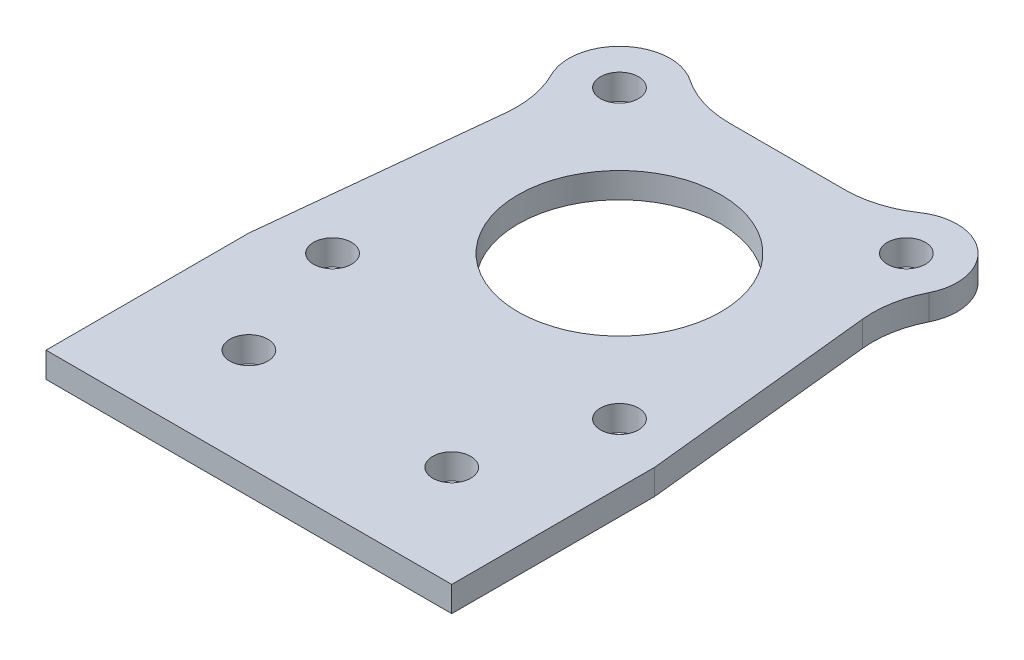
ISO-10303-21;
HEADER;
FILE_DESCRIPTION(('STEP AP214'),'2;1');
FILE_NAME('part.step','',(''),(''),'','','');
FILE_SCHEMA(('AUTOMOTIVE_DESIGN { 1 0 10303 214 1 1 1 1 }'));
ENDSEC;
DATA;
#1=APPLICATION_CONTEXT('core data for automotive mechanical design processes');
#2=APPLICATION_PROTOCOL_DEFINITION('international standard','automotive_design',2000,#1);
#3=PRODUCT_CONTEXT('',#1,'mechanical');
#4=PRODUCT('Part','Part','',(#3));
#5=PRODUCT_RELATED_PRODUCT_CATEGORY('part','',(#4));
#6=PRODUCT_DEFINITION_FORMATION('','',#4);
#7=PRODUCT_DEFINITION_CONTEXT('part definition',#1,'design');
#8=PRODUCT_DEFINITION('design','',#6,#7);
#9=PRODUCT_DEFINITION_SHAPE('','',#8);
#10=(LENGTH_UNIT() NAMED_UNIT(*) SI_UNIT(.MILLI.,.METRE.));
#11=(NAMED_UNIT(*) PLANE_ANGLE_UNIT() SI_UNIT($,.RADIAN.));
#12=(NAMED_UNIT(*) SI_UNIT($,.STERADIAN.) SOLID_ANGLE_UNIT());
#13=UNCERTAINTY_MEASURE_WITH_UNIT(LENGTH_MEASURE(1.E-05),#10,'distance_accuracy_value','');
#14=(GEOMETRIC_REPRESENTATION_CONTEXT(3) GLOBAL_UNCERTAINTY_ASSIGNED_CONTEXT((#13)) GLOBAL_UNIT_ASSIGNED_CONTEXT((#10,
#11,#12)) REPRESENTATION_CONTEXT('',''));
#15=CARTESIAN_POINT('',(0.,0.,0.));
#16=DIRECTION('',(0.,0.,1.));
#17=DIRECTION('',(1.,0.,0.));
#18=AXIS2_PLACEMENT_3D('',#15,#16,#17);
#19=CARTESIAN_POINT('',(-46.4,3.175,0.));
#20=DIRECTION('',(0.994557231920338,0.,0.104191710010702));
#21=DIRECTION('',(0.104191710010702,0.,-0.994557231920338));
#22=AXIS2_PLACEMENT_3D('',#19,#20,#21);
#23=PLANE('',#22);
#24=DIRECTION('',(-0.104191710010702,0.,0.994557231920338));
#25=VECTOR('',#24,1.);
#26=CARTESIAN_POINT('',(-46.4,3.175,0.));
#27=LINE('',#26,#25);
#28=CARTESIAN_POINT('',(-43.35282821594,3.175,-29.0866397569361));
#29=VERTEX_POINT('',#28);
#30=CARTESIAN_POINT('',(-46.4,3.175,0.));
#31=VERTEX_POINT('',#30);
#32=EDGE_CURVE('E118',#29,#31,#27,.T.);
#33=ORIENTED_EDGE('',*,*,#32,.F.);
#34=DIRECTION('',(0.,1.,0.));
#35=VECTOR('',#34,1.);
#36=CARTESIAN_POINT('',(-43.35282821594,3.175,-29.0866397569361));
#37=LINE('',#36,#35);
#38=CARTESIAN_POINT('',(-43.35282821594,0.,-29.0866397569361));
#39=VERTEX_POINT('',#38);
#40=EDGE_CURVE('E163',#29,#39,#37,.F.);
#41=ORIENTED_EDGE('',*,*,#40,.T.);
#42=DIRECTION('',(-0.104191710010702,0.,0.994557231920338));
#43=VECTOR('',#42,1.);
#44=CARTESIAN_POINT('',(-46.4,0.,0.));
#45=LINE('',#44,#43);
#46=CARTESIAN_POINT('',(-46.4,0.,0.));
#47=VERTEX_POINT('',#46);
#48=EDGE_CURVE('E139',#39,#47,#45,.T.);
#49=ORIENTED_EDGE('',*,*,#48,.T.);
#50=DIRECTION('',(0.,-1.,0.));
#51=VECTOR('',#50,1.);
#52=CARTESIAN_POINT('',(-46.4,3.175,0.));
#53=LINE('',#52,#51);
#54=EDGE_CURVE('E132',#31,#47,#53,.T.);
#55=ORIENTED_EDGE('',*,*,#54,.F.);
#56=EDGE_LOOP('',(#33,#41,#49,#55));
#57=FACE_BOUND('',#56,.T.);
#58=ADVANCED_FACE('F33',(#57),#23,.F.);
#59=CARTESIAN_POINT('',(-46.4,3.175,0.));
#60=DIRECTION('',(1.,0.,0.));
#61=DIRECTION('',(0.,0.,-1.));
#62=AXIS2_PLACEMENT_3D('',#59,#60,#61);
#63=PLANE('',#62);
#64=DIRECTION('',(0.,0.,1.));
#65=VECTOR('',#64,1.);
#66=CARTESIAN_POINT('',(-46.4,0.,0.));
#67=LINE('',#66,#65);
#68=CARTESIAN_POINT('',(-46.4,0.,25.4));
#69=VERTEX_POINT('',#68);
#70=EDGE_CURVE('E239',#47,#69,#67,.T.);
#71=ORIENTED_EDGE('',*,*,#70,.T.);
#72=DIRECTION('',(0.,-1.,0.));
#73=VECTOR('',#72,1.);
#74=CARTESIAN_POINT('',(-46.4,3.175,25.4));
#75=LINE('',#74,#73);
#76=CARTESIAN_POINT('',(-46.4,3.175,25.4));
#77=VERTEX_POINT('',#76);
#78=EDGE_CURVE('E134',#77,#69,#75,.T.);
#79=ORIENTED_EDGE('',*,*,#78,.F.);
#80=DIRECTION('',(0.,0.,1.));
#81=VECTOR('',#80,1.);
#82=CARTESIAN_POINT('',(-46.4,3.175,0.));
#83=LINE('',#82,#81);
#84=EDGE_CURVE('E123',#31,#77,#83,.T.);
#85=ORIENTED_EDGE('',*,*,#84,.F.);
#86=ORIENTED_EDGE('',*,*,#54,.T.);
#87=EDGE_LOOP('',(#71,#79,#85,#86));
#88=FACE_BOUND('',#87,.T.);
#89=ADVANCED_FACE('F131',(#88),#63,.F.);
#90=CARTESIAN_POINT('',(4.40000000000001,3.175,25.4));
#91=DIRECTION('',(0.,0.,-1.));
#92=DIRECTION('',(-1.,0.,0.));
#93=AXIS2_PLACEMENT_3D('',#90,#91,#92);
#94=PLANE('',#93);
#95=DIRECTION('',(1.,0.,0.));
#96=VECTOR('',#95,1.);
#97=CARTESIAN_POINT('',(4.40000000000001,0.,25.4));
#98=LINE('',#97,#96);
#99=CARTESIAN_POINT('',(4.40000000000001,0.,25.4));
#100=VERTEX_POINT('',#99);
#101=EDGE_CURVE('E242',#69,#100,#98,.T.);
#102=ORIENTED_EDGE('',*,*,#101,.T.);
#103=DIRECTION('',(0.,-1.,0.));
#104=VECTOR('',#103,1.);
#105=CARTESIAN_POINT('',(4.40000000000001,3.175,25.4));
#106=LINE('',#105,#104);
#107=CARTESIAN_POINT('',(4.40000000000001,3.175,25.4));
#108=VERTEX_POINT('',#107);
#109=EDGE_CURVE('E146',#108,#100,#106,.T.);
#110=ORIENTED_EDGE('',*,*,#109,.F.);
#111=DIRECTION('',(1.,0.,0.));
#112=VECTOR('',#111,1.);
#113=CARTESIAN_POINT('',(4.40000000000001,3.175,25.4));
#114=LINE('',#113,#112);
#115=EDGE_CURVE('E136',#77,#108,#114,.T.);
#116=ORIENTED_EDGE('',*,*,#115,.F.);
#117=ORIENTED_EDGE('',*,*,#78,.T.);
#118=EDGE_LOOP('',(#102,#110,#116,#117));
#119=FACE_BOUND('',#118,.T.);
#120=ADVANCED_FACE('F203',(#119),#94,.F.);
#121=CARTESIAN_POINT('',(4.40000000000001,3.175,0.));
#122=DIRECTION('',(-1.,0.,0.));
#123=DIRECTION('',(0.,0.,1.));
#124=AXIS2_PLACEMENT_3D('',#121,#122,#123);
#125=PLANE('',#124);
#126=DIRECTION('',(0.,0.,-1.));
#127=VECTOR('',#126,1.);
#128=CARTESIAN_POINT('',(4.40000000000001,0.,0.));
#129=LINE('',#128,#127);
#130=CARTESIAN_POINT('',(4.40000000000001,0.,0.));
#131=VERTEX_POINT('',#130);
#132=EDGE_CURVE('E244',#100,#131,#129,.T.);
#133=ORIENTED_EDGE('',*,*,#132,.T.);
#134=DIRECTION('',(0.,-1.,0.));
#135=VECTOR('',#134,1.);
#136=CARTESIAN_POINT('',(4.40000000000001,3.175,0.));
#137=LINE('',#136,#135);
#138=CARTESIAN_POINT('',(4.40000000000001,3.175,0.));
#139=VERTEX_POINT('',#138);
#140=EDGE_CURVE('E229',#139,#131,#137,.T.);
#141=ORIENTED_EDGE('',*,*,#140,.F.);
#142=DIRECTION('',(0.,0.,-1.));
#143=VECTOR('',#142,1.);
#144=CARTESIAN_POINT('',(4.40000000000001,3.175,0.));
#145=LINE('',#144,#143);
#146=EDGE_CURVE('E234',#108,#139,#145,.T.);
#147=ORIENTED_EDGE('',*,*,#146,.F.);
#148=ORIENTED_EDGE('',*,*,#109,.T.);
#149=EDGE_LOOP('',(#133,#141,#147,#148));
#150=FACE_BOUND('',#149,.T.);
#151=ADVANCED_FACE('F254',(#150),#125,.F.);
#152=CARTESIAN_POINT('',(0.,3.175,-42.));
#153=DIRECTION('',(-0.994557231920338,0.,0.104191710010702));
#154=DIRECTION('',(0.104191710010702,0.,0.994557231920338));
#155=AXIS2_PLACEMENT_3D('',#152,#153,#154);
#156=PLANE('',#155);
#157=DIRECTION('',(-0.104191710010702,0.,-0.994557231920338));
#158=VECTOR('',#157,1.);
#159=CARTESIAN_POINT('',(0.,0.,-42.));
#160=LINE('',#159,#158);
#161=CARTESIAN_POINT('',(1.35282821594003,0.,-29.0866397569361));
#162=VERTEX_POINT('',#161);
#163=EDGE_CURVE('E246',#131,#162,#160,.T.);
#164=ORIENTED_EDGE('',*,*,#163,.T.);
#165=DIRECTION('',(0.,1.,0.));
#166=VECTOR('',#165,1.);
#167=CARTESIAN_POINT('',(1.35282821594003,3.175,-29.0866397569361));
#168=LINE('',#167,#166);
#169=CARTESIAN_POINT('',(1.35282821594003,3.175,-29.0866397569361));
#170=VERTEX_POINT('',#169);
#171=EDGE_CURVE('E141',#162,#170,#168,.T.);
#172=ORIENTED_EDGE('',*,*,#171,.T.);
#173=DIRECTION('',(-0.104191710010702,0.,-0.994557231920338));
#174=VECTOR('',#173,1.);
#175=CARTESIAN_POINT('',(0.,3.175,-42.));
#176=LINE('',#175,#174);
#177=EDGE_CURVE('E230',#139,#170,#176,.T.);
#178=ORIENTED_EDGE('',*,*,#177,.F.);
#179=ORIENTED_EDGE('',*,*,#140,.T.);
#180=EDGE_LOOP('',(#164,#172,#178,#179));
#181=FACE_BOUND('',#180,.T.);
#182=ADVANCED_FACE('F263',(#181),#156,.F.);
#183=CARTESIAN_POINT('',(0.,3.175,-42.));
#184=DIRECTION('',(0.,0.,1.));
#185=DIRECTION('',(1.,0.,0.));
#186=AXIS2_PLACEMENT_3D('',#183,#184,#185);
#187=PLANE('',#186);
#188=DIRECTION('',(-1.,0.,0.));
#189=VECTOR('',#188,1.);
#190=CARTESIAN_POINT('',(0.,3.175,-42.));
#191=LINE('',#190,#189);
#192=CARTESIAN_POINT('',(-13.771264177454,3.175,-42.));
#193=VERTEX_POINT('',#192);
#194=CARTESIAN_POINT('',(-28.228735822546,3.175,-42.));
#195=VERTEX_POINT('',#194);
#196=EDGE_CURVE('E222',#193,#195,#191,.T.);
#197=ORIENTED_EDGE('',*,*,#196,.F.);
#198=DIRECTION('',(0.,1.,0.));
#199=VECTOR('',#198,1.);
#200=CARTESIAN_POINT('',(-13.771264177454,3.175,-42.));
#201=LINE('',#200,#199);
#202=CARTESIAN_POINT('',(-13.771264177454,0.,-42.));
#203=VERTEX_POINT('',#202);
#204=EDGE_CURVE('E156',#193,#203,#201,.F.);
#205=ORIENTED_EDGE('',*,*,#204,.T.);
#206=DIRECTION('',(-1.,0.,0.));
#207=VECTOR('',#206,1.);
#208=CARTESIAN_POINT('',(0.,0.,-42.));
#209=LINE('',#208,#207);
#210=CARTESIAN_POINT('',(-28.228735822546,0.,-42.));
#211=VERTEX_POINT('',#210);
#212=EDGE_CURVE('E127',#203,#211,#209,.T.);
#213=ORIENTED_EDGE('',*,*,#212,.T.);
#214=DIRECTION('',(0.,1.,0.));
#215=VECTOR('',#214,1.);
#216=CARTESIAN_POINT('',(-28.228735822546,3.175,-42.));
#217=LINE('',#216,#215);
#218=EDGE_CURVE('E153',#211,#195,#217,.T.);
#219=ORIENTED_EDGE('',*,*,#218,.T.);
#220=EDGE_LOOP('',(#197,#205,#213,#219));
#221=FACE_BOUND('',#220,.T.);
#222=ADVANCED_FACE('F226',(#221),#187,.F.);
#223=CARTESIAN_POINT('',(0.,3.175,0.));
#224=DIRECTION('',(0.,1.,0.));
#225=DIRECTION('',(0.,0.,1.));
#226=AXIS2_PLACEMENT_3D('',#223,#224,#225);
#227=PLANE('',#226);
#228=CARTESIAN_POINT('',(-33.7,3.175,12.7));
#229=DIRECTION('',(0.,1.,0.));
#230=DIRECTION('',(0.,0.,1.));
#231=AXIS2_PLACEMENT_3D('',#228,#229,#230);
#232=CIRCLE('',#231,2.38125);
#233=CARTESIAN_POINT('',(-33.7,3.175,15.08125));
#234=VERTEX_POINT('',#233);
#235=EDGE_CURVE('E360',#234,#234,#232,.T.);
#236=ORIENTED_EDGE('',*,*,#235,.F.);
#237=EDGE_LOOP('',(#236));
#238=FACE_BOUND('',#237,.T.);
#239=CARTESIAN_POINT('',(-8.3,3.175,12.7));
#240=DIRECTION('',(0.,1.,0.));
#241=DIRECTION('',(0.,0.,1.));
#242=AXIS2_PLACEMENT_3D('',#239,#240,#241);
#243=CIRCLE('',#242,2.38125);
#244=CARTESIAN_POINT('',(-8.3,3.175,15.08125));
#245=VERTEX_POINT('',#244);
#246=EDGE_CURVE('E274',#245,#245,#243,.T.);
#247=ORIENTED_EDGE('',*,*,#246,.F.);
#248=EDGE_LOOP('',(#247));
#249=FACE_BOUND('',#248,.T.);
#250=ORIENTED_EDGE('',*,*,#177,.T.);
#251=CARTESIAN_POINT('',(13.9837050613283,3.175,-30.409874474072));
#252=DIRECTION('',(0.,1.,0.));
#253=DIRECTION('',(0.,0.,1.));
#254=AXIS2_PLACEMENT_3D('',#251,#252,#253);
#255=CIRCLE('',#254,12.7);
#256=CARTESIAN_POINT('',(2.63490984853505,3.175,-36.1102996527828));
#257=VERTEX_POINT('',#256);
#258=EDGE_CURVE('E165',#170,#257,#255,.F.);
#259=ORIENTED_EDGE('',*,*,#258,.T.);
#260=CARTESIAN_POINT('',(-3.0394877578616,3.175,-38.9605122421382));
#261=DIRECTION('',(0.,1.,0.));
#262=DIRECTION('',(0.,0.,-1.));
#263=AXIS2_PLACEMENT_3D('',#260,#261,#262);
#264=CIRCLE('',#263,6.35);
#265=CARTESIAN_POINT('',(-6.61674656439239,3.175,-44.2070081614255));
#266=VERTEX_POINT('',#265);
#267=EDGE_CURVE('E224',#257,#266,#264,.T.);
#268=ORIENTED_EDGE('',*,*,#267,.T.);
#269=CARTESIAN_POINT('',(-13.771264177454,3.175,-54.7));
#270=DIRECTION('',(0.,1.,0.));
#271=DIRECTION('',(0.,0.,1.));
#272=AXIS2_PLACEMENT_3D('',#269,#270,#271);
#273=CIRCLE('',#272,12.7);
#274=EDGE_CURVE('E171',#266,#193,#273,.F.);
#275=ORIENTED_EDGE('',*,*,#274,.T.);
#276=ORIENTED_EDGE('',*,*,#196,.T.);
#277=CARTESIAN_POINT('',(-28.228735822546,3.175,-54.7));
#278=DIRECTION('',(0.,1.,0.));
#279=DIRECTION('',(0.,0.,1.));
#280=AXIS2_PLACEMENT_3D('',#277,#278,#279);
#281=CIRCLE('',#280,12.7);
#282=CARTESIAN_POINT('',(-35.3832534356076,3.175,-44.2070081614255));
#283=VERTEX_POINT('',#282);
#284=EDGE_CURVE('E173',#195,#283,#281,.F.);
#285=ORIENTED_EDGE('',*,*,#284,.T.);
#286=CARTESIAN_POINT('',(-38.9605122421384,3.175,-38.9605122421382));
#287=DIRECTION('',(0.,1.,0.));
#288=DIRECTION('',(0.,0.,1.));
#289=AXIS2_PLACEMENT_3D('',#286,#287,#288);
#290=CIRCLE('',#289,6.35);
#291=CARTESIAN_POINT('',(-44.6349098485351,3.175,-36.1102996527828));
#292=VERTEX_POINT('',#291);
#293=EDGE_CURVE('E189',#283,#292,#290,.T.);
#294=ORIENTED_EDGE('',*,*,#293,.T.);
#295=CARTESIAN_POINT('',(-55.9837050613283,3.175,-30.409874474072));
#296=DIRECTION('',(0.,1.,0.));
#297=DIRECTION('',(0.,0.,1.));
#298=AXIS2_PLACEMENT_3D('',#295,#296,#297);
#299=CIRCLE('',#298,12.7);
#300=EDGE_CURVE('E11',#292,#29,#299,.F.);
#301=ORIENTED_EDGE('',*,*,#300,.T.);
#302=ORIENTED_EDGE('',*,*,#32,.T.);
#303=ORIENTED_EDGE('',*,*,#84,.T.);
#304=ORIENTED_EDGE('',*,*,#115,.T.);
#305=ORIENTED_EDGE('',*,*,#146,.T.);
#306=EDGE_LOOP('',(#250,#259,#268,#275,#276,#285,#294,#301,#302,#303,#304,#305));
#307=FACE_BOUND('',#306,.T.);
#308=CARTESIAN_POINT('',(-3.03948775786098,3.175,-3.03948775786242));
#309=DIRECTION('',(0.,1.,0.));
#310=DIRECTION('',(0.,0.,1.));
#311=AXIS2_PLACEMENT_3D('',#308,#309,#310);
#312=CIRCLE('',#311,2.38125);
#313=CARTESIAN_POINT('',(-3.03948775786098,3.175,-0.658237757862424));
#314=VERTEX_POINT('',#313);
#315=EDGE_CURVE('E281',#314,#314,#312,.T.);
#316=ORIENTED_EDGE('',*,*,#315,.F.);
#317=EDGE_LOOP('',(#316));
#318=FACE_BOUND('',#317,.T.);
#319=CARTESIAN_POINT('',(-38.9605122421376,3.175,-3.03948775786153));
#320=DIRECTION('',(0.,1.,0.));
#321=DIRECTION('',(0.,0.,1.));
#322=AXIS2_PLACEMENT_3D('',#319,#320,#321);
#323=CIRCLE('',#322,2.38125);
#324=CARTESIAN_POINT('',(-38.9605122421376,3.175,-0.658237757861529));
#325=VERTEX_POINT('',#324);
#326=EDGE_CURVE('E287',#325,#325,#323,.T.);
#327=ORIENTED_EDGE('',*,*,#326,.F.);
#328=EDGE_LOOP('',(#327));
#329=FACE_BOUND('',#328,.T.);
#330=CARTESIAN_POINT('',(-21.,3.175,-21.));
#331=DIRECTION('',(0.,1.,0.));
#332=DIRECTION('',(0.,0.,1.));
#333=AXIS2_PLACEMENT_3D('',#330,#331,#332);
#334=CIRCLE('',#333,12.7);
#335=CARTESIAN_POINT('',(-21.,3.175,-8.30000000000001));
#336=VERTEX_POINT('',#335);
#337=EDGE_CURVE('E299',#336,#336,#334,.T.);
#338=ORIENTED_EDGE('',*,*,#337,.F.);
#339=EDGE_LOOP('',(#338));
#340=FACE_BOUND('',#339,.T.);
#341=CARTESIAN_POINT('',(-38.9605122421384,3.175,-38.9605122421382));
#342=DIRECTION('',(0.,1.,0.));
#343=DIRECTION('',(0.,0.,1.));
#344=AXIS2_PLACEMENT_3D('',#341,#342,#343);
#345=CIRCLE('',#344,2.38125);
#346=CARTESIAN_POINT('',(-38.9605122421384,3.175,-36.5792622421382));
#347=VERTEX_POINT('',#346);
#348=EDGE_CURVE('E293',#347,#347,#345,.T.);
#349=ORIENTED_EDGE('',*,*,#348,.F.);
#350=EDGE_LOOP('',(#349));
#351=FACE_BOUND('',#350,.T.);
#352=CARTESIAN_POINT('',(-3.03948775786199,3.175,-38.9605122421391));
#353=DIRECTION('',(0.,1.,0.));
#354=DIRECTION('',(0.,0.,1.));
#355=AXIS2_PLACEMENT_3D('',#352,#353,#354);
#356=CIRCLE('',#355,2.38125);
#357=CARTESIAN_POINT('',(-3.03948775786199,3.175,-36.5792622421391));
#358=VERTEX_POINT('',#357);
#359=EDGE_CURVE('E188',#358,#358,#356,.T.);
#360=ORIENTED_EDGE('',*,*,#359,.F.);
#361=EDGE_LOOP('',(#360));
#362=FACE_BOUND('',#361,.T.);
#363=ADVANCED_FACE('F121',(#238,#249,#307,#318,#329,#340,#351,#362),#227,.T.);
#364=CARTESIAN_POINT('',(0.,0.,0.));
#365=DIRECTION('',(0.,1.,0.));
#366=DIRECTION('',(0.,0.,1.));
#367=AXIS2_PLACEMENT_3D('',#364,#365,#366);
#368=PLANE('',#367);
#369=CARTESIAN_POINT('',(-33.7,0.,12.7));
#370=DIRECTION('',(0.,1.,0.));
#371=DIRECTION('',(0.,0.,1.));
#372=AXIS2_PLACEMENT_3D('',#369,#370,#371);
#373=CIRCLE('',#372,2.38125);
#374=CARTESIAN_POINT('',(-33.7,0.,15.08125));
#375=VERTEX_POINT('',#374);
#376=EDGE_CURVE('E357',#375,#375,#373,.T.);
#377=ORIENTED_EDGE('',*,*,#376,.T.);
#378=EDGE_LOOP('',(#377));
#379=FACE_BOUND('',#378,.T.);
#380=CARTESIAN_POINT('',(-8.3,0.,12.7));
#381=DIRECTION('',(0.,1.,0.));
#382=DIRECTION('',(0.,0.,1.));
#383=AXIS2_PLACEMENT_3D('',#380,#381,#382);
#384=CIRCLE('',#383,2.38125);
#385=CARTESIAN_POINT('',(-8.3,0.,15.08125));
#386=VERTEX_POINT('',#385);
#387=EDGE_CURVE('E270',#386,#386,#384,.T.);
#388=ORIENTED_EDGE('',*,*,#387,.T.);
#389=EDGE_LOOP('',(#388));
#390=FACE_BOUND('',#389,.T.);
#391=ORIENTED_EDGE('',*,*,#212,.F.);
#392=CARTESIAN_POINT('',(-13.771264177454,0.,-54.7));
#393=DIRECTION('',(0.,1.,0.));
#394=DIRECTION('',(0.,0.,1.));
#395=AXIS2_PLACEMENT_3D('',#392,#393,#394);
#396=CIRCLE('',#395,12.7);
#397=CARTESIAN_POINT('',(-6.61674656439239,0.,-44.2070081614255));
#398=VERTEX_POINT('',#397);
#399=EDGE_CURVE('E169',#203,#398,#396,.T.);
#400=ORIENTED_EDGE('',*,*,#399,.T.);
#401=CARTESIAN_POINT('',(-3.0394877578616,0.,-38.9605122421382));
#402=DIRECTION('',(0.,1.,0.));
#403=DIRECTION('',(0.,0.,1.));
#404=AXIS2_PLACEMENT_3D('',#401,#402,#403);
#405=CIRCLE('',#404,6.35);
#406=CARTESIAN_POINT('',(2.63490984853505,0.,-36.1102996527828));
#407=VERTEX_POINT('',#406);
#408=EDGE_CURVE('E269',#398,#407,#405,.F.);
#409=ORIENTED_EDGE('',*,*,#408,.T.);
#410=CARTESIAN_POINT('',(13.9837050613283,0.,-30.409874474072));
#411=DIRECTION('',(0.,1.,0.));
#412=DIRECTION('',(0.,0.,1.));
#413=AXIS2_PLACEMENT_3D('',#410,#411,#412);
#414=CIRCLE('',#413,12.7);
#415=EDGE_CURVE('E167',#407,#162,#414,.T.);
#416=ORIENTED_EDGE('',*,*,#415,.T.);
#417=ORIENTED_EDGE('',*,*,#163,.F.);
#418=ORIENTED_EDGE('',*,*,#132,.F.);
#419=ORIENTED_EDGE('',*,*,#101,.F.);
#420=ORIENTED_EDGE('',*,*,#70,.F.);
#421=ORIENTED_EDGE('',*,*,#48,.F.);
#422=CARTESIAN_POINT('',(-55.9837050613283,0.,-30.409874474072));
#423=DIRECTION('',(0.,1.,0.));
#424=DIRECTION('',(0.,0.,1.));
#425=AXIS2_PLACEMENT_3D('',#422,#423,#424);
#426=CIRCLE('',#425,12.7);
#427=CARTESIAN_POINT('',(-44.6349098485351,0.,-36.1102996527828));
#428=VERTEX_POINT('',#427);
#429=EDGE_CURVE('E41',#39,#428,#426,.T.);
#430=ORIENTED_EDGE('',*,*,#429,.T.);
#431=CARTESIAN_POINT('',(-38.9605122421384,0.,-38.9605122421382));
#432=DIRECTION('',(0.,1.,0.));
#433=DIRECTION('',(0.,0.,1.));
#434=AXIS2_PLACEMENT_3D('',#431,#432,#433);
#435=CIRCLE('',#434,6.35);
#436=CARTESIAN_POINT('',(-35.3832534356076,0.,-44.2070081614255));
#437=VERTEX_POINT('',#436);
#438=EDGE_CURVE('E182',#428,#437,#435,.F.);
#439=ORIENTED_EDGE('',*,*,#438,.T.);
#440=CARTESIAN_POINT('',(-28.228735822546,0.,-54.7));
#441=DIRECTION('',(0.,1.,0.));
#442=DIRECTION('',(0.,0.,1.));
#443=AXIS2_PLACEMENT_3D('',#440,#441,#442);
#444=CIRCLE('',#443,12.7);
#445=EDGE_CURVE('E175',#437,#211,#444,.T.);
#446=ORIENTED_EDGE('',*,*,#445,.T.);
#447=EDGE_LOOP('',(#391,#400,#409,#416,#417,#418,#419,#420,#421,#430,#439,#446));
#448=FACE_BOUND('',#447,.T.);
#449=CARTESIAN_POINT('',(-3.03948775786098,0.,-3.03948775786242));
#450=DIRECTION('',(0.,1.,0.));
#451=DIRECTION('',(0.,0.,1.));
#452=AXIS2_PLACEMENT_3D('',#449,#450,#451);
#453=CIRCLE('',#452,2.38125);
#454=CARTESIAN_POINT('',(-3.03948775786098,0.,-0.658237757862424));
#455=VERTEX_POINT('',#454);
#456=EDGE_CURVE('E284',#455,#455,#453,.T.);
#457=ORIENTED_EDGE('',*,*,#456,.T.);
#458=EDGE_LOOP('',(#457));
#459=FACE_BOUND('',#458,.T.);
#460=CARTESIAN_POINT('',(-38.9605122421376,0.,-3.03948775786153));
#461=DIRECTION('',(0.,1.,0.));
#462=DIRECTION('',(0.,0.,1.));
#463=AXIS2_PLACEMENT_3D('',#460,#461,#462);
#464=CIRCLE('',#463,2.38125);
#465=CARTESIAN_POINT('',(-38.9605122421376,0.,-0.658237757861529));
#466=VERTEX_POINT('',#465);
#467=EDGE_CURVE('E290',#466,#466,#464,.T.);
#468=ORIENTED_EDGE('',*,*,#467,.T.);
#469=EDGE_LOOP('',(#468));
#470=FACE_BOUND('',#469,.T.);
#471=CARTESIAN_POINT('',(-21.,0.,-21.));
#472=DIRECTION('',(0.,1.,0.));
#473=DIRECTION('',(0.,0.,1.));
#474=AXIS2_PLACEMENT_3D('',#471,#472,#473);
#475=CIRCLE('',#474,12.7);
#476=CARTESIAN_POINT('',(-21.,0.,-8.30000000000001));
#477=VERTEX_POINT('',#476);
#478=EDGE_CURVE('E240',#477,#477,#475,.T.);
#479=ORIENTED_EDGE('',*,*,#478,.T.);
#480=EDGE_LOOP('',(#479));
#481=FACE_BOUND('',#480,.T.);
#482=CARTESIAN_POINT('',(-38.9605122421384,0.,-38.9605122421382));
#483=DIRECTION('',(0.,1.,0.));
#484=DIRECTION('',(0.,0.,1.));
#485=AXIS2_PLACEMENT_3D('',#482,#483,#484);
#486=CIRCLE('',#485,2.38125);
#487=CARTESIAN_POINT('',(-38.9605122421384,0.,-36.5792622421382));
#488=VERTEX_POINT('',#487);
#489=EDGE_CURVE('E296',#488,#488,#486,.T.);
#490=ORIENTED_EDGE('',*,*,#489,.T.);
#491=EDGE_LOOP('',(#490));
#492=FACE_BOUND('',#491,.T.);
#493=CARTESIAN_POINT('',(-3.03948775786199,0.,-38.9605122421391));
#494=DIRECTION('',(0.,1.,0.));
#495=DIRECTION('',(0.,0.,1.));
#496=AXIS2_PLACEMENT_3D('',#493,#494,#495);
#497=CIRCLE('',#496,2.38125);
#498=CARTESIAN_POINT('',(-3.03948775786199,0.,-36.5792622421391));
#499=VERTEX_POINT('',#498);
#500=EDGE_CURVE('E278',#499,#499,#497,.T.);
#501=ORIENTED_EDGE('',*,*,#500,.T.);
#502=EDGE_LOOP('',(#501));
#503=FACE_BOUND('',#502,.T.);
#504=ADVANCED_FACE('F180',(#379,#390,#448,#459,#470,#481,#492,#503),#368,.F.);
#505=CARTESIAN_POINT('',(-21.,3.175,-21.));
#506=DIRECTION('',(0.,1.,0.));
#507=DIRECTION('',(0.,0.,1.));
#508=AXIS2_PLACEMENT_3D('',#505,#506,#507);
#509=CYLINDRICAL_SURFACE('',#508,12.7);
#510=ORIENTED_EDGE('',*,*,#478,.F.);
#511=EDGE_LOOP('',(#510));
#512=FACE_BOUND('',#511,.T.);
#513=ORIENTED_EDGE('',*,*,#337,.T.);
#514=EDGE_LOOP('',(#513));
#515=FACE_BOUND('',#514,.T.);
#516=ADVANCED_FACE('F318',(#512,#515),#509,.F.);
#517=CARTESIAN_POINT('',(-38.9605122421384,0.,-38.9605122421382));
#518=DIRECTION('',(0.,1.,0.));
#519=DIRECTION('',(0.,0.,1.));
#520=AXIS2_PLACEMENT_3D('',#517,#518,#519);
#521=CYLINDRICAL_SURFACE('',#520,2.38125);
#522=ORIENTED_EDGE('',*,*,#489,.F.);
#523=EDGE_LOOP('',(#522));
#524=FACE_BOUND('',#523,.T.);
#525=ORIENTED_EDGE('',*,*,#348,.T.);
#526=EDGE_LOOP('',(#525));
#527=FACE_BOUND('',#526,.T.);
#528=ADVANCED_FACE('F325',(#524,#527),#521,.F.);
#529=CARTESIAN_POINT('',(-38.9605122421376,0.,-3.03948775786153));
#530=DIRECTION('',(0.,1.,0.));
#531=DIRECTION('',(0.,0.,1.));
#532=AXIS2_PLACEMENT_3D('',#529,#530,#531);
#533=CYLINDRICAL_SURFACE('',#532,2.38125);
#534=ORIENTED_EDGE('',*,*,#467,.F.);
#535=EDGE_LOOP('',(#534));
#536=FACE_BOUND('',#535,.T.);
#537=ORIENTED_EDGE('',*,*,#326,.T.);
#538=EDGE_LOOP('',(#537));
#539=FACE_BOUND('',#538,.T.);
#540=ADVANCED_FACE('F329',(#536,#539),#533,.F.);
#541=CARTESIAN_POINT('',(-3.03948775786098,0.,-3.03948775786242));
#542=DIRECTION('',(0.,1.,0.));
#543=DIRECTION('',(0.,0.,1.));
#544=AXIS2_PLACEMENT_3D('',#541,#542,#543);
#545=CYLINDRICAL_SURFACE('',#544,2.38125);
#546=ORIENTED_EDGE('',*,*,#456,.F.);
#547=EDGE_LOOP('',(#546));
#548=FACE_BOUND('',#547,.T.);
#549=ORIENTED_EDGE('',*,*,#315,.T.);
#550=EDGE_LOOP('',(#549));
#551=FACE_BOUND('',#550,.T.);
#552=ADVANCED_FACE('F333',(#548,#551),#545,.F.);
#553=CARTESIAN_POINT('',(-3.03948775786199,0.,-38.9605122421391));
#554=DIRECTION('',(0.,1.,0.));
#555=DIRECTION('',(0.,0.,1.));
#556=AXIS2_PLACEMENT_3D('',#553,#554,#555);
#557=CYLINDRICAL_SURFACE('',#556,2.38125);
#558=ORIENTED_EDGE('',*,*,#500,.F.);
#559=EDGE_LOOP('',(#558));
#560=FACE_BOUND('',#559,.T.);
#561=ORIENTED_EDGE('',*,*,#359,.T.);
#562=EDGE_LOOP('',(#561));
#563=FACE_BOUND('',#562,.T.);
#564=ADVANCED_FACE('F337',(#560,#563),#557,.F.);
#565=CARTESIAN_POINT('',(-38.9605122421384,-17.9605122421383,-38.9605122421382));
#566=DIRECTION('',(0.,1.,0.));
#567=DIRECTION('',(0.,0.,1.));
#568=AXIS2_PLACEMENT_3D('',#565,#566,#567);
#569=CYLINDRICAL_SURFACE('',#568,6.35);
#570=ORIENTED_EDGE('',*,*,#293,.F.);
#571=DIRECTION('',(0.,1.,0.));
#572=VECTOR('',#571,1.);
#573=CARTESIAN_POINT('',(-35.3832534356076,-17.9605122421383,-44.2070081614255));
#574=LINE('',#573,#572);
#575=EDGE_CURVE('E161',#283,#437,#574,.F.);
#576=ORIENTED_EDGE('',*,*,#575,.T.);
#577=ORIENTED_EDGE('',*,*,#438,.F.);
#578=DIRECTION('',(0.,1.,0.));
#579=VECTOR('',#578,1.);
#580=CARTESIAN_POINT('',(-44.6349098485351,-17.9605122421383,-36.1102996527828));
#581=LINE('',#580,#579);
#582=EDGE_CURVE('E159',#428,#292,#581,.T.);
#583=ORIENTED_EDGE('',*,*,#582,.T.);
#584=EDGE_LOOP('',(#570,#576,#577,#583));
#585=FACE_BOUND('',#584,.T.);
#586=ADVANCED_FACE('F186',(#585),#569,.T.);
#587=CARTESIAN_POINT('',(-3.0394877578616,-17.9605122421383,-38.9605122421382));
#588=DIRECTION('',(0.,1.,0.));
#589=DIRECTION('',(0.,0.,1.));
#590=AXIS2_PLACEMENT_3D('',#587,#588,#589);
#591=CYLINDRICAL_SURFACE('',#590,6.35);
#592=ORIENTED_EDGE('',*,*,#267,.F.);
#593=DIRECTION('',(0.,1.,0.));
#594=VECTOR('',#593,1.);
#595=CARTESIAN_POINT('',(2.63490984853504,-17.9605122421383,-36.1102996527828));
#596=LINE('',#595,#594);
#597=EDGE_CURVE('E151',#257,#407,#596,.F.);
#598=ORIENTED_EDGE('',*,*,#597,.T.);
#599=ORIENTED_EDGE('',*,*,#408,.F.);
#600=DIRECTION('',(0.,1.,0.));
#601=VECTOR('',#600,1.);
#602=CARTESIAN_POINT('',(-6.61674656439239,-17.9605122421383,-44.2070081614255));
#603=LINE('',#602,#601);
#604=EDGE_CURVE('E144',#398,#266,#603,.T.);
#605=ORIENTED_EDGE('',*,*,#604,.T.);
#606=EDGE_LOOP('',(#592,#598,#599,#605));
#607=FACE_BOUND('',#606,.T.);
#608=ADVANCED_FACE('F267',(#607),#591,.T.);
#609=CARTESIAN_POINT('',(-8.3,3.175,12.7));
#610=DIRECTION('',(0.,1.,0.));
#611=DIRECTION('',(0.,0.,1.));
#612=AXIS2_PLACEMENT_3D('',#609,#610,#611);
#613=CYLINDRICAL_SURFACE('',#612,2.38125);
#614=ORIENTED_EDGE('',*,*,#387,.F.);
#615=EDGE_LOOP('',(#614));
#616=FACE_BOUND('',#615,.T.);
#617=ORIENTED_EDGE('',*,*,#246,.T.);
#618=EDGE_LOOP('',(#617));
#619=FACE_BOUND('',#618,.T.);
#620=ADVANCED_FACE('F346',(#616,#619),#613,.F.);
#621=CARTESIAN_POINT('',(-33.7,3.175,12.7));
#622=DIRECTION('',(0.,1.,0.));
#623=DIRECTION('',(0.,0.,1.));
#624=AXIS2_PLACEMENT_3D('',#621,#622,#623);
#625=CYLINDRICAL_SURFACE('',#624,2.38125);
#626=ORIENTED_EDGE('',*,*,#376,.F.);
#627=EDGE_LOOP('',(#626));
#628=FACE_BOUND('',#627,.T.);
#629=ORIENTED_EDGE('',*,*,#235,.T.);
#630=EDGE_LOOP('',(#629));
#631=FACE_BOUND('',#630,.T.);
#632=ADVANCED_FACE('F210',(#628,#631),#625,.F.);
#633=CARTESIAN_POINT('',(13.9837050613283,-17.9605122421383,-30.409874474072));
#634=DIRECTION('',(0.,1.,0.));
#635=DIRECTION('',(0.,0.,1.));
#636=AXIS2_PLACEMENT_3D('',#633,#634,#635);
#637=CYLINDRICAL_SURFACE('',#636,12.7);
#638=ORIENTED_EDGE('',*,*,#415,.F.);
#639=ORIENTED_EDGE('',*,*,#597,.F.);
#640=ORIENTED_EDGE('',*,*,#258,.F.);
#641=ORIENTED_EDGE('',*,*,#171,.F.);
#642=EDGE_LOOP('',(#638,#639,#640,#641));
#643=FACE_BOUND('',#642,.T.);
#644=ADVANCED_FACE('F207',(#643),#637,.F.);
#645=CARTESIAN_POINT('',(-13.771264177454,-17.9605122421383,-54.7));
#646=DIRECTION('',(0.,1.,0.));
#647=DIRECTION('',(0.,0.,1.));
#648=AXIS2_PLACEMENT_3D('',#645,#646,#647);
#649=CYLINDRICAL_SURFACE('',#648,12.7);
#650=ORIENTED_EDGE('',*,*,#274,.F.);
#651=ORIENTED_EDGE('',*,*,#604,.F.);
#652=ORIENTED_EDGE('',*,*,#399,.F.);
#653=ORIENTED_EDGE('',*,*,#204,.F.);
#654=EDGE_LOOP('',(#650,#651,#652,#653));
#655=FACE_BOUND('',#654,.T.);
#656=ADVANCED_FACE('F196',(#655),#649,.F.);
#657=CARTESIAN_POINT('',(-28.228735822546,-17.9605122421383,-54.7));
#658=DIRECTION('',(0.,1.,0.));
#659=DIRECTION('',(0.,0.,1.));
#660=AXIS2_PLACEMENT_3D('',#657,#658,#659);
#661=CYLINDRICAL_SURFACE('',#660,12.7);
#662=ORIENTED_EDGE('',*,*,#445,.F.);
#663=ORIENTED_EDGE('',*,*,#575,.F.);
#664=ORIENTED_EDGE('',*,*,#284,.F.);
#665=ORIENTED_EDGE('',*,*,#218,.F.);
#666=EDGE_LOOP('',(#662,#663,#664,#665));
#667=FACE_BOUND('',#666,.T.);
#668=ADVANCED_FACE('F192',(#667),#661,.F.);
#669=CARTESIAN_POINT('',(-55.9837050613283,-17.9605122421383,-30.409874474072));
#670=DIRECTION('',(0.,1.,0.));
#671=DIRECTION('',(0.,0.,1.));
#672=AXIS2_PLACEMENT_3D('',#669,#670,#671);
#673=CYLINDRICAL_SURFACE('',#672,12.7);
#674=ORIENTED_EDGE('',*,*,#300,.F.);
#675=ORIENTED_EDGE('',*,*,#582,.F.);
#676=ORIENTED_EDGE('',*,*,#429,.F.);
#677=ORIENTED_EDGE('',*,*,#40,.F.);
#678=EDGE_LOOP('',(#674,#675,#676,#677));
#679=FACE_BOUND('',#678,.T.);
#680=ADVANCED_FACE('F35',(#679),#673,.F.);
#681=CLOSED_SHELL('',(#58,#89,#120,#151,#182,#222,#363,#504,#516,#528,#540,#552,#564,#586,#608,
#620,#632,#644,#656,#668,#680));
#682=MANIFOLD_SOLID_BREP('B2',#681);
#683=ADVANCED_BREP_SHAPE_REPRESENTATION('',(#18,#682),#14);
#684=SHAPE_DEFINITION_REPRESENTATION(#9,#683);
ENDSEC;
END-ISO-10303-21;
